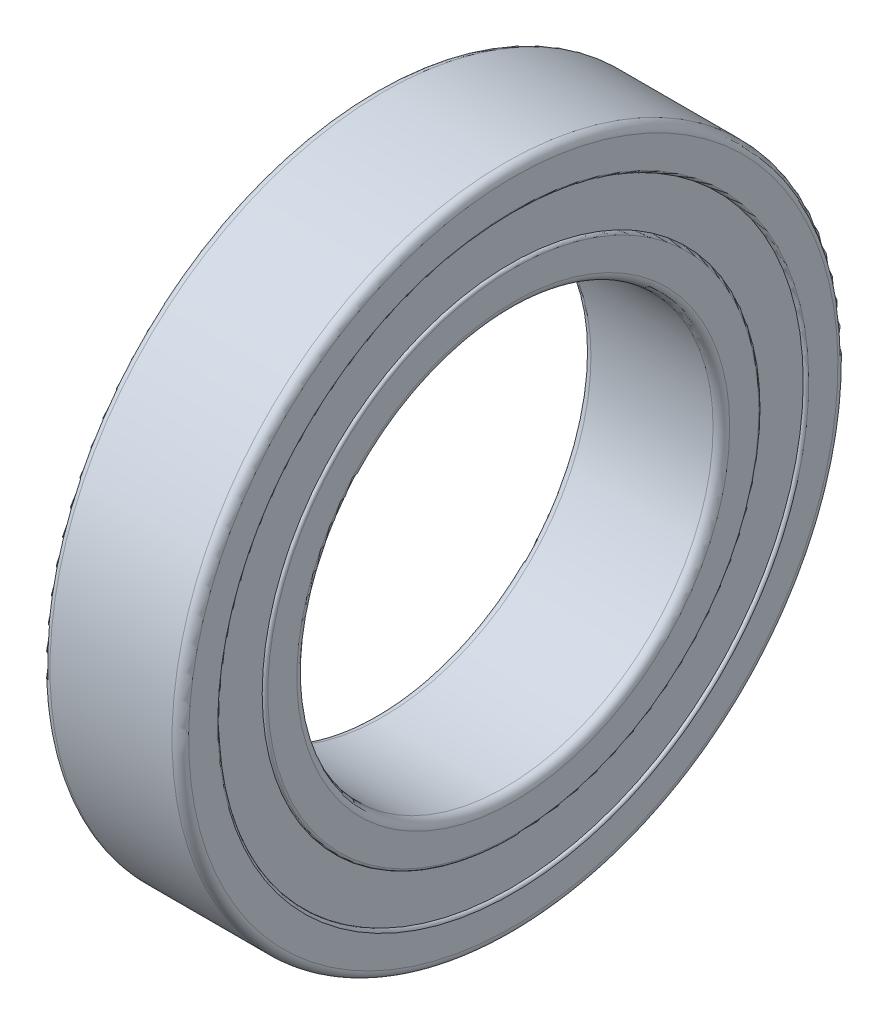
ISO-10303-21;
HEADER;
FILE_DESCRIPTION(('STEP AP214'),'2;1');
FILE_NAME('part.step','',(''),(''),'','','');
FILE_SCHEMA(('AUTOMOTIVE_DESIGN { 1 0 10303 214 1 1 1 1 }'));
ENDSEC;
DATA;
#1=APPLICATION_CONTEXT('core data for automotive mechanical design processes');
#2=APPLICATION_PROTOCOL_DEFINITION('international standard','automotive_design',2000,#1);
#3=PRODUCT_CONTEXT('',#1,'mechanical');
#4=PRODUCT('Part','Part','',(#3));
#5=PRODUCT_RELATED_PRODUCT_CATEGORY('part','',(#4));
#6=PRODUCT_DEFINITION_FORMATION('','',#4);
#7=PRODUCT_DEFINITION_CONTEXT('part definition',#1,'design');
#8=PRODUCT_DEFINITION('design','',#6,#7);
#9=PRODUCT_DEFINITION_SHAPE('','',#8);
#10=(LENGTH_UNIT() NAMED_UNIT(*) SI_UNIT(.MILLI.,.METRE.));
#11=(NAMED_UNIT(*) PLANE_ANGLE_UNIT() SI_UNIT($,.RADIAN.));
#12=(NAMED_UNIT(*) SI_UNIT($,.STERADIAN.) SOLID_ANGLE_UNIT());
#13=UNCERTAINTY_MEASURE_WITH_UNIT(LENGTH_MEASURE(1.E-05),#10,'distance_accuracy_value','');
#14=(GEOMETRIC_REPRESENTATION_CONTEXT(3) GLOBAL_UNCERTAINTY_ASSIGNED_CONTEXT((#13)) GLOBAL_UNIT_ASSIGNED_CONTEXT((#10,
#11,#12)) REPRESENTATION_CONTEXT('',''));
#15=CARTESIAN_POINT('',(0.,0.,0.));
#16=DIRECTION('',(0.,0.,1.));
#17=DIRECTION('',(1.,0.,0.));
#18=AXIS2_PLACEMENT_3D('',#15,#16,#17);
#19=CARTESIAN_POINT('',(0.850000000000005,0.,0.));
#20=DIRECTION('',(1.,0.,0.));
#21=DIRECTION('',(0.,0.,-1.));
#22=AXIS2_PLACEMENT_3D('',#19,#20,#21);
#23=PLANE('',#22);
#24=CARTESIAN_POINT('',(0.850000000000005,0.,0.));
#25=DIRECTION('',(1.,0.,0.));
#26=DIRECTION('',(0.,0.,-1.));
#27=AXIS2_PLACEMENT_3D('',#24,#25,#26);
#28=CIRCLE('',#27,10.55);
#29=CARTESIAN_POINT('',(0.850000000000005,0.,-10.55));
#30=VERTEX_POINT('',#29);
#31=EDGE_CURVE('P0_E10',#30,#30,#28,.T.);
#32=ORIENTED_EDGE('',*,*,#31,.T.);
#33=EDGE_LOOP('',(#32));
#34=FACE_BOUND('',#33,.T.);
#35=CARTESIAN_POINT('',(0.850000000000005,0.,0.));
#36=DIRECTION('',(1.,0.,0.));
#37=DIRECTION('',(0.,0.,-1.));
#38=AXIS2_PLACEMENT_3D('',#35,#36,#37);
#39=CIRCLE('',#38,8.95);
#40=CARTESIAN_POINT('',(0.850000000000005,0.,-8.95));
#41=VERTEX_POINT('',#40);
#42=EDGE_CURVE('P0_E25',#41,#41,#39,.T.);
#43=ORIENTED_EDGE('',*,*,#42,.F.);
#44=EDGE_LOOP('',(#43));
#45=FACE_BOUND('',#44,.T.);
#46=ADVANCED_FACE('P0_F14',(#34,#45),#23,.T.);
#47=CARTESIAN_POINT('',(0.100000000000005,0.,0.));
#48=DIRECTION('',(1.,0.,0.));
#49=DIRECTION('',(0.,0.,-1.));
#50=AXIS2_PLACEMENT_3D('',#47,#48,#49);
#51=PLANE('',#50);
#52=CARTESIAN_POINT('',(0.100000000000005,0.,0.));
#53=DIRECTION('',(1.,0.,0.));
#54=DIRECTION('',(0.,0.,-1.));
#55=AXIS2_PLACEMENT_3D('',#52,#53,#54);
#56=CIRCLE('',#55,10.55);
#57=CARTESIAN_POINT('',(0.100000000000005,0.,-10.55));
#58=VERTEX_POINT('',#57);
#59=EDGE_CURVE('P0_E18',#58,#58,#56,.T.);
#60=ORIENTED_EDGE('',*,*,#59,.F.);
#61=EDGE_LOOP('',(#60));
#62=FACE_BOUND('',#61,.T.);
#63=CARTESIAN_POINT('',(0.100000000000005,0.,0.));
#64=DIRECTION('',(1.,0.,0.));
#65=DIRECTION('',(0.,0.,-1.));
#66=AXIS2_PLACEMENT_3D('',#63,#64,#65);
#67=CIRCLE('',#66,8.95);
#68=CARTESIAN_POINT('',(0.100000000000005,0.,-8.95));
#69=VERTEX_POINT('',#68);
#70=EDGE_CURVE('P0_E27',#69,#69,#67,.T.);
#71=ORIENTED_EDGE('',*,*,#70,.T.);
#72=EDGE_LOOP('',(#71));
#73=FACE_BOUND('',#72,.T.);
#74=ADVANCED_FACE('P0_F37',(#62,#73),#51,.F.);
#75=CARTESIAN_POINT('',(0.850000000000005,0.,0.));
#76=DIRECTION('',(-1.,0.,0.));
#77=DIRECTION('',(0.,0.,1.));
#78=AXIS2_PLACEMENT_3D('',#75,#76,#77);
#79=CYLINDRICAL_SURFACE('',#78,10.55);
#80=ORIENTED_EDGE('',*,*,#31,.F.);
#81=EDGE_LOOP('',(#80));
#82=FACE_BOUND('',#81,.T.);
#83=ORIENTED_EDGE('',*,*,#59,.T.);
#84=EDGE_LOOP('',(#83));
#85=FACE_BOUND('',#84,.T.);
#86=ADVANCED_FACE('P0_F16',(#82,#85),#79,.T.);
#87=CARTESIAN_POINT('',(0.850000000000005,0.,0.));
#88=DIRECTION('',(-1.,0.,0.));
#89=DIRECTION('',(0.,0.,1.));
#90=AXIS2_PLACEMENT_3D('',#87,#88,#89);
#91=CYLINDRICAL_SURFACE('',#90,8.95);
#92=ORIENTED_EDGE('',*,*,#42,.T.);
#93=EDGE_LOOP('',(#92));
#94=FACE_BOUND('',#93,.T.);
#95=ORIENTED_EDGE('',*,*,#70,.F.);
#96=EDGE_LOOP('',(#95));
#97=FACE_BOUND('',#96,.T.);
#98=ADVANCED_FACE('P0_F33',(#94,#97),#91,.F.);
#99=CLOSED_SHELL('',(#46,#74,#86,#98));
#100=MANIFOLD_SOLID_BREP('P0_B1',#99);
#101=CARTESIAN_POINT('',(4.9,0.,0.));
#102=DIRECTION('',(1.,0.,0.));
#103=DIRECTION('',(0.,0.,-1.));
#104=AXIS2_PLACEMENT_3D('',#101,#102,#103);
#105=PLANE('',#104);
#106=CARTESIAN_POINT('',(4.9,0.,0.));
#107=DIRECTION('',(1.,0.,0.));
#108=DIRECTION('',(0.,0.,-1.));
#109=AXIS2_PLACEMENT_3D('',#106,#107,#108);
#110=CIRCLE('',#109,10.55);
#111=CARTESIAN_POINT('',(4.9,0.,-10.55));
#112=VERTEX_POINT('',#111);
#113=EDGE_CURVE('P1_E10',#112,#112,#110,.T.);
#114=ORIENTED_EDGE('',*,*,#113,.T.);
#115=EDGE_LOOP('',(#114));
#116=FACE_BOUND('',#115,.T.);
#117=CARTESIAN_POINT('',(4.9,0.,0.));
#118=DIRECTION('',(1.,0.,0.));
#119=DIRECTION('',(0.,0.,-1.));
#120=AXIS2_PLACEMENT_3D('',#117,#118,#119);
#121=CIRCLE('',#120,8.95);
#122=CARTESIAN_POINT('',(4.9,0.,-8.95));
#123=VERTEX_POINT('',#122);
#124=EDGE_CURVE('P1_E25',#123,#123,#121,.T.);
#125=ORIENTED_EDGE('',*,*,#124,.F.);
#126=EDGE_LOOP('',(#125));
#127=FACE_BOUND('',#126,.T.);
#128=ADVANCED_FACE('P1_F14',(#116,#127),#105,.T.);
#129=CARTESIAN_POINT('',(4.15,0.,0.));
#130=DIRECTION('',(1.,0.,0.));
#131=DIRECTION('',(0.,0.,-1.));
#132=AXIS2_PLACEMENT_3D('',#129,#130,#131);
#133=PLANE('',#132);
#134=CARTESIAN_POINT('',(4.15,0.,0.));
#135=DIRECTION('',(1.,0.,0.));
#136=DIRECTION('',(0.,0.,-1.));
#137=AXIS2_PLACEMENT_3D('',#134,#135,#136);
#138=CIRCLE('',#137,10.55);
#139=CARTESIAN_POINT('',(4.15,0.,-10.55));
#140=VERTEX_POINT('',#139);
#141=EDGE_CURVE('P1_E18',#140,#140,#138,.T.);
#142=ORIENTED_EDGE('',*,*,#141,.F.);
#143=EDGE_LOOP('',(#142));
#144=FACE_BOUND('',#143,.T.);
#145=CARTESIAN_POINT('',(4.15,0.,0.));
#146=DIRECTION('',(1.,0.,0.));
#147=DIRECTION('',(0.,0.,-1.));
#148=AXIS2_PLACEMENT_3D('',#145,#146,#147);
#149=CIRCLE('',#148,8.95);
#150=CARTESIAN_POINT('',(4.15,0.,-8.95));
#151=VERTEX_POINT('',#150);
#152=EDGE_CURVE('P1_E27',#151,#151,#149,.T.);
#153=ORIENTED_EDGE('',*,*,#152,.T.);
#154=EDGE_LOOP('',(#153));
#155=FACE_BOUND('',#154,.T.);
#156=ADVANCED_FACE('P1_F37',(#144,#155),#133,.F.);
#157=CARTESIAN_POINT('',(4.9,0.,0.));
#158=DIRECTION('',(-1.,0.,0.));
#159=DIRECTION('',(0.,0.,1.));
#160=AXIS2_PLACEMENT_3D('',#157,#158,#159);
#161=CYLINDRICAL_SURFACE('',#160,10.55);
#162=ORIENTED_EDGE('',*,*,#113,.F.);
#163=EDGE_LOOP('',(#162));
#164=FACE_BOUND('',#163,.T.);
#165=ORIENTED_EDGE('',*,*,#141,.T.);
#166=EDGE_LOOP('',(#165));
#167=FACE_BOUND('',#166,.T.);
#168=ADVANCED_FACE('P1_F16',(#164,#167),#161,.T.);
#169=CARTESIAN_POINT('',(4.9,0.,0.));
#170=DIRECTION('',(-1.,0.,0.));
#171=DIRECTION('',(0.,0.,1.));
#172=AXIS2_PLACEMENT_3D('',#169,#170,#171);
#173=CYLINDRICAL_SURFACE('',#172,8.95);
#174=ORIENTED_EDGE('',*,*,#124,.T.);
#175=EDGE_LOOP('',(#174));
#176=FACE_BOUND('',#175,.T.);
#177=ORIENTED_EDGE('',*,*,#152,.F.);
#178=EDGE_LOOP('',(#177));
#179=FACE_BOUND('',#178,.T.);
#180=ADVANCED_FACE('P1_F33',(#176,#179),#173,.F.);
#181=CLOSED_SHELL('',(#128,#156,#168,#180));
#182=MANIFOLD_SOLID_BREP('P1_B1',#181);
#183=CARTESIAN_POINT('',(0.299999999999941,0.,0.));
#184=DIRECTION('',(1.,0.,0.));
#185=DIRECTION('',(0.,0.,-1.));
#186=AXIS2_PLACEMENT_3D('',#183,#184,#185);
#187=TOROIDAL_SURFACE('',#186,7.79999999999994,0.299999999999941);
#188=CARTESIAN_POINT('',(0.3,0.,0.));
#189=DIRECTION('',(1.,0.,0.));
#190=DIRECTION('',(0.,0.,-1.));
#191=AXIS2_PLACEMENT_3D('',#188,#189,#190);
#192=CIRCLE('',#191,7.5);
#193=CARTESIAN_POINT('',(0.3,0.,-7.5));
#194=VERTEX_POINT('',#193);
#195=EDGE_CURVE('P2_E10',#194,#194,#192,.T.);
#196=ORIENTED_EDGE('',*,*,#195,.T.);
#197=EDGE_LOOP('',(#196));
#198=FACE_BOUND('',#197,.T.);
#199=CARTESIAN_POINT('',(0.,0.,0.));
#200=DIRECTION('',(1.,0.,0.));
#201=DIRECTION('',(0.,0.,-1.));
#202=AXIS2_PLACEMENT_3D('',#199,#200,#201);
#203=CIRCLE('',#202,7.8);
#204=CARTESIAN_POINT('',(0.,0.,-7.8));
#205=VERTEX_POINT('',#204);
#206=EDGE_CURVE('P2_E48',#205,#205,#203,.T.);
#207=ORIENTED_EDGE('',*,*,#206,.F.);
#208=EDGE_LOOP('',(#207));
#209=FACE_BOUND('',#208,.T.);
#210=ADVANCED_FACE('P2_F14',(#198,#209),#187,.T.);
#211=CARTESIAN_POINT('',(4.7,0.,0.));
#212=DIRECTION('',(1.,0.,0.));
#213=DIRECTION('',(0.,0.,-1.));
#214=AXIS2_PLACEMENT_3D('',#211,#212,#213);
#215=CYLINDRICAL_SURFACE('',#214,7.5);
#216=CARTESIAN_POINT('',(4.7,0.,0.));
#217=DIRECTION('',(1.,0.,0.));
#218=DIRECTION('',(0.,0.,-1.));
#219=AXIS2_PLACEMENT_3D('',#216,#217,#218);
#220=CIRCLE('',#219,7.5);
#221=CARTESIAN_POINT('',(4.7,0.,-7.5));
#222=VERTEX_POINT('',#221);
#223=EDGE_CURVE('P2_E20',#222,#222,#220,.T.);
#224=ORIENTED_EDGE('',*,*,#223,.T.);
#225=EDGE_LOOP('',(#224));
#226=FACE_BOUND('',#225,.T.);
#227=ORIENTED_EDGE('',*,*,#195,.F.);
#228=EDGE_LOOP('',(#227));
#229=FACE_BOUND('',#228,.T.);
#230=ADVANCED_FACE('P2_F56',(#226,#229),#215,.F.);
#231=CARTESIAN_POINT('',(4.70000000000012,0.,0.));
#232=DIRECTION('',(1.,0.,0.));
#233=DIRECTION('',(0.,0.,-1.));
#234=AXIS2_PLACEMENT_3D('',#231,#232,#233);
#235=TOROIDAL_SURFACE('',#234,7.79999999999988,0.29999999999988);
#236=CARTESIAN_POINT('',(5.,0.,0.));
#237=DIRECTION('',(1.,0.,0.));
#238=DIRECTION('',(0.,0.,-1.));
#239=AXIS2_PLACEMENT_3D('',#236,#237,#238);
#240=CIRCLE('',#239,7.8);
#241=CARTESIAN_POINT('',(5.,0.,-7.8));
#242=VERTEX_POINT('',#241);
#243=EDGE_CURVE('P2_E24',#242,#242,#240,.T.);
#244=ORIENTED_EDGE('',*,*,#243,.T.);
#245=EDGE_LOOP('',(#244));
#246=FACE_BOUND('',#245,.T.);
#247=ORIENTED_EDGE('',*,*,#223,.F.);
#248=EDGE_LOOP('',(#247));
#249=FACE_BOUND('',#248,.T.);
#250=ADVANCED_FACE('P2_F62',(#246,#249),#235,.T.);
#251=CARTESIAN_POINT('',(5.,7.8,0.));
#252=DIRECTION('',(1.,0.,0.));
#253=DIRECTION('',(0.,0.,-1.));
#254=AXIS2_PLACEMENT_3D('',#251,#252,#253);
#255=PLANE('',#254);
#256=CARTESIAN_POINT('',(5.,0.,0.));
#257=DIRECTION('',(1.,0.,0.));
#258=DIRECTION('',(0.,0.,-1.));
#259=AXIS2_PLACEMENT_3D('',#256,#257,#258);
#260=CIRCLE('',#259,8.85);
#261=CARTESIAN_POINT('',(5.,0.,-8.85));
#262=VERTEX_POINT('',#261);
#263=EDGE_CURVE('P2_E28',#262,#262,#260,.T.);
#264=ORIENTED_EDGE('',*,*,#263,.T.);
#265=EDGE_LOOP('',(#264));
#266=FACE_BOUND('',#265,.T.);
#267=ORIENTED_EDGE('',*,*,#243,.F.);
#268=EDGE_LOOP('',(#267));
#269=FACE_BOUND('',#268,.T.);
#270=ADVANCED_FACE('P2_F67',(#266,#269),#255,.T.);
#271=CARTESIAN_POINT('',(4.90000000000015,0.,0.));
#272=DIRECTION('',(1.,0.,0.));
#273=DIRECTION('',(0.,0.,-1.));
#274=AXIS2_PLACEMENT_3D('',#271,#272,#273);
#275=TOROIDAL_SURFACE('',#274,8.85000000000015,0.099999999999845);
#276=CARTESIAN_POINT('',(4.9,0.,0.));
#277=DIRECTION('',(1.,0.,0.));
#278=DIRECTION('',(0.,0.,-1.));
#279=AXIS2_PLACEMENT_3D('',#276,#277,#278);
#280=CIRCLE('',#279,8.95);
#281=CARTESIAN_POINT('',(4.9,0.,-8.95));
#282=VERTEX_POINT('',#281);
#283=EDGE_CURVE('P2_E33',#282,#282,#280,.T.);
#284=ORIENTED_EDGE('',*,*,#283,.T.);
#285=EDGE_LOOP('',(#284));
#286=FACE_BOUND('',#285,.T.);
#287=ORIENTED_EDGE('',*,*,#263,.F.);
#288=EDGE_LOOP('',(#287));
#289=FACE_BOUND('',#288,.T.);
#290=ADVANCED_FACE('P2_F74',(#286,#289),#275,.T.);
#291=CARTESIAN_POINT('',(4.7,0.,0.));
#292=DIRECTION('',(1.,0.,0.));
#293=DIRECTION('',(0.,0.,-1.));
#294=AXIS2_PLACEMENT_3D('',#291,#292,#293);
#295=CYLINDRICAL_SURFACE('',#294,8.95);
#296=CARTESIAN_POINT('',(3.3816406580915,0.,0.));
#297=DIRECTION('',(1.,0.,0.));
#298=DIRECTION('',(0.,0.,-1.));
#299=AXIS2_PLACEMENT_3D('',#296,#297,#298);
#300=CIRCLE('',#299,8.95);
#301=CARTESIAN_POINT('',(3.3816406580915,0.,-8.95));
#302=VERTEX_POINT('',#301);
#303=EDGE_CURVE('P2_E36',#302,#302,#300,.T.);
#304=ORIENTED_EDGE('',*,*,#303,.T.);
#305=EDGE_LOOP('',(#304));
#306=FACE_BOUND('',#305,.T.);
#307=ORIENTED_EDGE('',*,*,#283,.F.);
#308=EDGE_LOOP('',(#307));
#309=FACE_BOUND('',#308,.T.);
#310=ADVANCED_FACE('P2_F78',(#306,#309),#295,.T.);
#311=CARTESIAN_POINT('',(2.5,0.,0.));
#312=DIRECTION('',(1.,0.,0.));
#313=DIRECTION('',(0.,0.,-1.));
#314=AXIS2_PLACEMENT_3D('',#311,#312,#313);
#315=TOROIDAL_SURFACE('',#314,9.75000000000002,1.19050000000002);
#316=CARTESIAN_POINT('',(1.6183593419085,0.,0.));
#317=DIRECTION('',(1.,0.,0.));
#318=DIRECTION('',(0.,0.,-1.));
#319=AXIS2_PLACEMENT_3D('',#316,#317,#318);
#320=CIRCLE('',#319,8.95);
#321=CARTESIAN_POINT('',(1.6183593419085,0.,-8.95));
#322=VERTEX_POINT('',#321);
#323=EDGE_CURVE('P2_E39',#322,#322,#320,.T.);
#324=ORIENTED_EDGE('',*,*,#323,.T.);
#325=EDGE_LOOP('',(#324));
#326=FACE_BOUND('',#325,.T.);
#327=ORIENTED_EDGE('',*,*,#303,.F.);
#328=EDGE_LOOP('',(#327));
#329=FACE_BOUND('',#328,.T.);
#330=ADVANCED_FACE('P2_F82',(#326,#329),#315,.F.);
#331=CARTESIAN_POINT('',(4.7,0.,0.));
#332=DIRECTION('',(1.,0.,0.));
#333=DIRECTION('',(0.,0.,-1.));
#334=AXIS2_PLACEMENT_3D('',#331,#332,#333);
#335=CYLINDRICAL_SURFACE('',#334,8.95);
#336=CARTESIAN_POINT('',(0.1,0.,0.));
#337=DIRECTION('',(1.,0.,0.));
#338=DIRECTION('',(0.,0.,-1.));
#339=AXIS2_PLACEMENT_3D('',#336,#337,#338);
#340=CIRCLE('',#339,8.95);
#341=CARTESIAN_POINT('',(0.1,0.,-8.95));
#342=VERTEX_POINT('',#341);
#343=EDGE_CURVE('P2_E42',#342,#342,#340,.T.);
#344=ORIENTED_EDGE('',*,*,#343,.T.);
#345=EDGE_LOOP('',(#344));
#346=FACE_BOUND('',#345,.T.);
#347=ORIENTED_EDGE('',*,*,#323,.F.);
#348=EDGE_LOOP('',(#347));
#349=FACE_BOUND('',#348,.T.);
#350=ADVANCED_FACE('P2_F86',(#346,#349),#335,.T.);
#351=CARTESIAN_POINT('',(0.0999999999999208,0.,0.));
#352=DIRECTION('',(1.,0.,0.));
#353=DIRECTION('',(0.,0.,-1.));
#354=AXIS2_PLACEMENT_3D('',#351,#352,#353);
#355=TOROIDAL_SURFACE('',#354,8.85000000000008,0.0999999999999211);
#356=CARTESIAN_POINT('',(0.,0.,0.));
#357=DIRECTION('',(1.,0.,0.));
#358=DIRECTION('',(0.,0.,-1.));
#359=AXIS2_PLACEMENT_3D('',#356,#357,#358);
#360=CIRCLE('',#359,8.85);
#361=CARTESIAN_POINT('',(0.,0.,-8.85));
#362=VERTEX_POINT('',#361);
#363=EDGE_CURVE('P2_E45',#362,#362,#360,.T.);
#364=ORIENTED_EDGE('',*,*,#363,.T.);
#365=EDGE_LOOP('',(#364));
#366=FACE_BOUND('',#365,.T.);
#367=ORIENTED_EDGE('',*,*,#343,.F.);
#368=EDGE_LOOP('',(#367));
#369=FACE_BOUND('',#368,.T.);
#370=ADVANCED_FACE('P2_F90',(#366,#369),#355,.T.);
#371=CARTESIAN_POINT('',(0.,8.85,0.));
#372=DIRECTION('',(-1.,0.,0.));
#373=DIRECTION('',(0.,0.,1.));
#374=AXIS2_PLACEMENT_3D('',#371,#372,#373);
#375=PLANE('',#374);
#376=ORIENTED_EDGE('',*,*,#206,.T.);
#377=EDGE_LOOP('',(#376));
#378=FACE_BOUND('',#377,.T.);
#379=ORIENTED_EDGE('',*,*,#363,.F.);
#380=EDGE_LOOP('',(#379));
#381=FACE_BOUND('',#380,.T.);
#382=ADVANCED_FACE('P2_F52',(#378,#381),#375,.T.);
#383=CLOSED_SHELL('',(#210,#230,#250,#270,#290,#310,#330,#350,#370,#382));
#384=MANIFOLD_SOLID_BREP('P2_B1',#383);
#385=CARTESIAN_POINT('',(0.299999999999946,0.,0.));
#386=DIRECTION('',(1.,0.,0.));
#387=DIRECTION('',(0.,1.,0.));
#388=AXIS2_PLACEMENT_3D('',#385,#386,#387);
#389=TOROIDAL_SURFACE('',#388,11.7000000000001,0.299999999999942);
#390=CARTESIAN_POINT('',(0.,0.,0.));
#391=DIRECTION('',(1.,0.,0.));
#392=DIRECTION('',(0.,1.,0.));
#393=AXIS2_PLACEMENT_3D('',#390,#391,#392);
#394=CIRCLE('',#393,11.7);
#395=CARTESIAN_POINT('',(0.,11.7,0.));
#396=VERTEX_POINT('',#395);
#397=EDGE_CURVE('P3_E10',#396,#396,#394,.T.);
#398=ORIENTED_EDGE('',*,*,#397,.T.);
#399=EDGE_LOOP('',(#398));
#400=FACE_BOUND('',#399,.T.);
#401=CARTESIAN_POINT('',(0.300000000000004,0.,0.));
#402=DIRECTION('',(1.,0.,0.));
#403=DIRECTION('',(0.,1.,0.));
#404=AXIS2_PLACEMENT_3D('',#401,#402,#403);
#405=CIRCLE('',#404,12.);
#406=CARTESIAN_POINT('',(0.3,12.,0.));
#407=VERTEX_POINT('',#406);
#408=EDGE_CURVE('P3_E58',#407,#407,#405,.T.);
#409=ORIENTED_EDGE('',*,*,#408,.F.);
#410=EDGE_LOOP('',(#409));
#411=FACE_BOUND('',#410,.T.);
#412=ADVANCED_FACE('P3_F14',(#400,#411),#389,.T.);
#413=CARTESIAN_POINT('',(0.,11.7,0.));
#414=DIRECTION('',(-1.,0.,0.));
#415=DIRECTION('',(0.,-1.,0.));
#416=AXIS2_PLACEMENT_3D('',#413,#414,#415);
#417=PLANE('',#416);
#418=CARTESIAN_POINT('',(0.,0.,0.));
#419=DIRECTION('',(1.,0.,0.));
#420=DIRECTION('',(0.,1.,0.));
#421=AXIS2_PLACEMENT_3D('',#418,#419,#420);
#422=CIRCLE('',#421,10.65);
#423=CARTESIAN_POINT('',(0.,10.65,0.));
#424=VERTEX_POINT('',#423);
#425=EDGE_CURVE('P3_E21',#424,#424,#422,.T.);
#426=ORIENTED_EDGE('',*,*,#425,.T.);
#427=EDGE_LOOP('',(#426));
#428=FACE_BOUND('',#427,.T.);
#429=ORIENTED_EDGE('',*,*,#397,.F.);
#430=EDGE_LOOP('',(#429));
#431=FACE_BOUND('',#430,.T.);
#432=ADVANCED_FACE('P3_F67',(#428,#431),#417,.T.);
#433=CARTESIAN_POINT('',(0.0999999999994126,0.,0.));
#434=DIRECTION('',(1.,0.,0.));
#435=DIRECTION('',(0.,1.,0.));
#436=AXIS2_PLACEMENT_3D('',#433,#434,#435);
#437=TOROIDAL_SURFACE('',#436,10.6499999999994,0.0999999999994094);
#438=CARTESIAN_POINT('',(0.100000000000004,0.,0.));
#439=DIRECTION('',(1.,0.,0.));
#440=DIRECTION('',(0.,1.,0.));
#441=AXIS2_PLACEMENT_3D('',#438,#439,#440);
#442=CIRCLE('',#441,10.55);
#443=CARTESIAN_POINT('',(0.1,10.55,0.));
#444=VERTEX_POINT('',#443);
#445=EDGE_CURVE('P3_E27',#444,#444,#442,.T.);
#446=ORIENTED_EDGE('',*,*,#445,.T.);
#447=EDGE_LOOP('',(#446));
#448=FACE_BOUND('',#447,.T.);
#449=ORIENTED_EDGE('',*,*,#425,.F.);
#450=EDGE_LOOP('',(#449));
#451=FACE_BOUND('',#450,.T.);
#452=ADVANCED_FACE('P3_F73',(#448,#451),#437,.T.);
#453=CARTESIAN_POINT('',(5.,0.,0.));
#454=DIRECTION('',(1.,0.,0.));
#455=DIRECTION('',(0.,1.,0.));
#456=AXIS2_PLACEMENT_3D('',#453,#454,#455);
#457=CYLINDRICAL_SURFACE('',#456,10.55);
#458=CARTESIAN_POINT('',(1.6183593419085,0.,0.));
#459=DIRECTION('',(1.,0.,0.));
#460=DIRECTION('',(0.,1.,0.));
#461=AXIS2_PLACEMENT_3D('',#458,#459,#460);
#462=CIRCLE('',#461,10.55);
#463=CARTESIAN_POINT('',(1.6183593419085,10.55,0.));
#464=VERTEX_POINT('',#463);
#465=EDGE_CURVE('P3_E32',#464,#464,#462,.T.);
#466=ORIENTED_EDGE('',*,*,#465,.T.);
#467=EDGE_LOOP('',(#466));
#468=FACE_BOUND('',#467,.T.);
#469=ORIENTED_EDGE('',*,*,#445,.F.);
#470=EDGE_LOOP('',(#469));
#471=FACE_BOUND('',#470,.T.);
#472=ADVANCED_FACE('P3_F78',(#468,#471),#457,.F.);
#473=CARTESIAN_POINT('',(2.5,0.,0.));
#474=DIRECTION('',(1.,0.,0.));
#475=DIRECTION('',(0.,1.,0.));
#476=AXIS2_PLACEMENT_3D('',#473,#474,#475);
#477=TOROIDAL_SURFACE('',#476,9.74999999999998,1.19050000000002);
#478=CARTESIAN_POINT('',(3.3816406580915,0.,0.));
#479=DIRECTION('',(1.,0.,0.));
#480=DIRECTION('',(0.,1.,0.));
#481=AXIS2_PLACEMENT_3D('',#478,#479,#480);
#482=CIRCLE('',#481,10.55);
#483=CARTESIAN_POINT('',(3.3816406580915,10.55,0.));
#484=VERTEX_POINT('',#483);
#485=EDGE_CURVE('P3_E38',#484,#484,#482,.T.);
#486=ORIENTED_EDGE('',*,*,#485,.T.);
#487=EDGE_LOOP('',(#486));
#488=FACE_BOUND('',#487,.T.);
#489=ORIENTED_EDGE('',*,*,#465,.F.);
#490=EDGE_LOOP('',(#489));
#491=FACE_BOUND('',#490,.T.);
#492=ADVANCED_FACE('P3_F85',(#488,#491),#477,.F.);
#493=CARTESIAN_POINT('',(5.,0.,0.));
#494=DIRECTION('',(1.,0.,0.));
#495=DIRECTION('',(0.,1.,0.));
#496=AXIS2_PLACEMENT_3D('',#493,#494,#495);
#497=CYLINDRICAL_SURFACE('',#496,10.55);
#498=CARTESIAN_POINT('',(4.9,0.,0.));
#499=DIRECTION('',(1.,0.,0.));
#500=DIRECTION('',(0.,1.,0.));
#501=AXIS2_PLACEMENT_3D('',#498,#499,#500);
#502=CIRCLE('',#501,10.55);
#503=CARTESIAN_POINT('',(4.9,10.55,0.));
#504=VERTEX_POINT('',#503);
#505=EDGE_CURVE('P3_E42',#504,#504,#502,.T.);
#506=ORIENTED_EDGE('',*,*,#505,.T.);
#507=EDGE_LOOP('',(#506));
#508=FACE_BOUND('',#507,.T.);
#509=ORIENTED_EDGE('',*,*,#485,.F.);
#510=EDGE_LOOP('',(#509));
#511=FACE_BOUND('',#510,.T.);
#512=ADVANCED_FACE('P3_F89',(#508,#511),#497,.F.);
#513=CARTESIAN_POINT('',(4.90000000000067,0.,0.));
#514=DIRECTION('',(1.,0.,0.));
#515=DIRECTION('',(0.,1.,0.));
#516=AXIS2_PLACEMENT_3D('',#513,#514,#515);
#517=TOROIDAL_SURFACE('',#516,10.6499999999993,0.099999999999332);
#518=CARTESIAN_POINT('',(5.,0.,0.));
#519=DIRECTION('',(1.,0.,0.));
#520=DIRECTION('',(0.,1.,0.));
#521=AXIS2_PLACEMENT_3D('',#518,#519,#520);
#522=CIRCLE('',#521,10.65);
#523=CARTESIAN_POINT('',(5.,10.65,0.));
#524=VERTEX_POINT('',#523);
#525=EDGE_CURVE('P3_E46',#524,#524,#522,.T.);
#526=ORIENTED_EDGE('',*,*,#525,.T.);
#527=EDGE_LOOP('',(#526));
#528=FACE_BOUND('',#527,.T.);
#529=ORIENTED_EDGE('',*,*,#505,.F.);
#530=EDGE_LOOP('',(#529));
#531=FACE_BOUND('',#530,.T.);
#532=ADVANCED_FACE('P3_F93',(#528,#531),#517,.T.);
#533=CARTESIAN_POINT('',(5.,10.65,0.));
#534=DIRECTION('',(1.,0.,0.));
#535=DIRECTION('',(0.,1.,0.));
#536=AXIS2_PLACEMENT_3D('',#533,#534,#535);
#537=PLANE('',#536);
#538=CARTESIAN_POINT('',(5.,0.,0.));
#539=DIRECTION('',(1.,0.,0.));
#540=DIRECTION('',(0.,1.,0.));
#541=AXIS2_PLACEMENT_3D('',#538,#539,#540);
#542=CIRCLE('',#541,11.7);
#543=CARTESIAN_POINT('',(5.,11.7,0.));
#544=VERTEX_POINT('',#543);
#545=EDGE_CURVE('P3_E50',#544,#544,#542,.T.);
#546=ORIENTED_EDGE('',*,*,#545,.T.);
#547=EDGE_LOOP('',(#546));
#548=FACE_BOUND('',#547,.T.);
#549=ORIENTED_EDGE('',*,*,#525,.F.);
#550=EDGE_LOOP('',(#549));
#551=FACE_BOUND('',#550,.T.);
#552=ADVANCED_FACE('P3_F97',(#548,#551),#537,.T.);
#553=CARTESIAN_POINT('',(4.70000000000013,0.,0.));
#554=DIRECTION('',(1.,0.,0.));
#555=DIRECTION('',(0.,1.,0.));
#556=AXIS2_PLACEMENT_3D('',#553,#554,#555);
#557=TOROIDAL_SURFACE('',#556,11.7000000000001,0.29999999999988);
#558=CARTESIAN_POINT('',(4.7,0.,0.));
#559=DIRECTION('',(1.,0.,0.));
#560=DIRECTION('',(0.,1.,0.));
#561=AXIS2_PLACEMENT_3D('',#558,#559,#560);
#562=CIRCLE('',#561,12.);
#563=CARTESIAN_POINT('',(4.7,12.,0.));
#564=VERTEX_POINT('',#563);
#565=EDGE_CURVE('P3_E54',#564,#564,#562,.T.);
#566=ORIENTED_EDGE('',*,*,#565,.T.);
#567=EDGE_LOOP('',(#566));
#568=FACE_BOUND('',#567,.T.);
#569=ORIENTED_EDGE('',*,*,#545,.F.);
#570=EDGE_LOOP('',(#569));
#571=FACE_BOUND('',#570,.T.);
#572=ADVANCED_FACE('P3_F101',(#568,#571),#557,.T.);
#573=CARTESIAN_POINT('',(5.,0.,0.));
#574=DIRECTION('',(1.,0.,0.));
#575=DIRECTION('',(0.,1.,0.));
#576=AXIS2_PLACEMENT_3D('',#573,#574,#575);
#577=CYLINDRICAL_SURFACE('',#576,12.);
#578=ORIENTED_EDGE('',*,*,#408,.T.);
#579=EDGE_LOOP('',(#578));
#580=FACE_BOUND('',#579,.T.);
#581=ORIENTED_EDGE('',*,*,#565,.F.);
#582=EDGE_LOOP('',(#581));
#583=FACE_BOUND('',#582,.T.);
#584=ADVANCED_FACE('P3_F63',(#580,#583),#577,.T.);
#585=CLOSED_SHELL('',(#412,#432,#452,#472,#492,#512,#532,#552,#572,#584));
#586=MANIFOLD_SOLID_BREP('P3_B1',#585);
#587=ADVANCED_BREP_SHAPE_REPRESENTATION('',(#18,#100,#182,#384,#586),#14);
#588=SHAPE_DEFINITION_REPRESENTATION(#9,#587);
ENDSEC;
END-ISO-10303-21;
